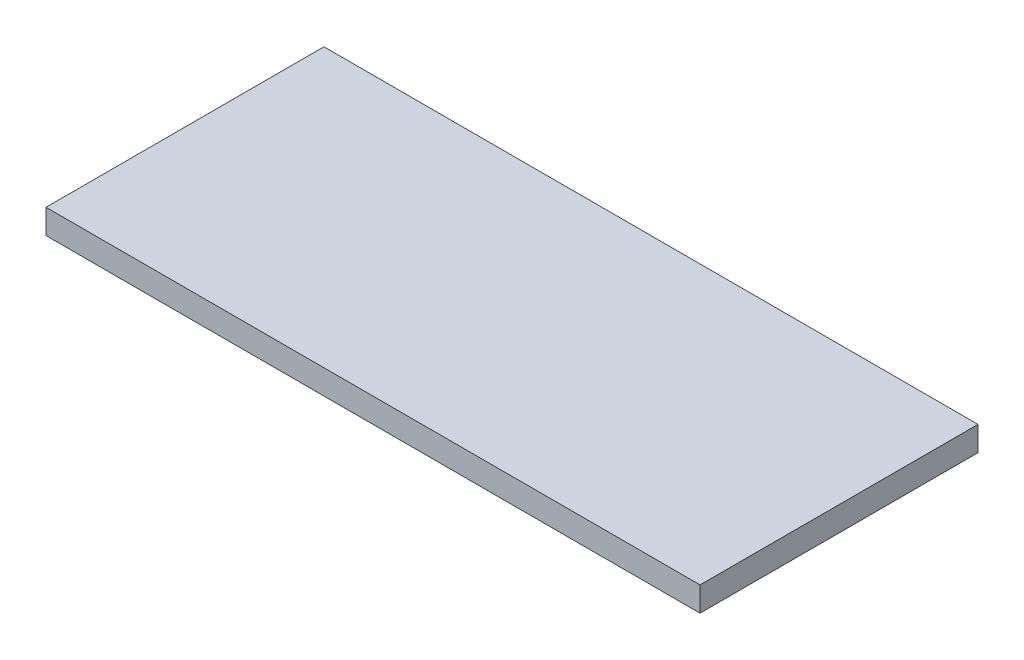
ISO-10303-21;
HEADER;
FILE_DESCRIPTION(('STEP AP214'),'2;1');
FILE_NAME('part.step','',(''),(''),'','','');
FILE_SCHEMA(('AUTOMOTIVE_DESIGN { 1 0 10303 214 1 1 1 1 }'));
ENDSEC;
DATA;
#1=APPLICATION_CONTEXT('core data for automotive mechanical design processes');
#2=APPLICATION_PROTOCOL_DEFINITION('international standard','automotive_design',2000,#1);
#3=PRODUCT_CONTEXT('',#1,'mechanical');
#4=PRODUCT('Part','Part','',(#3));
#5=PRODUCT_RELATED_PRODUCT_CATEGORY('part','',(#4));
#6=PRODUCT_DEFINITION_FORMATION('','',#4);
#7=PRODUCT_DEFINITION_CONTEXT('part definition',#1,'design');
#8=PRODUCT_DEFINITION('design','',#6,#7);
#9=PRODUCT_DEFINITION_SHAPE('','',#8);
#10=(LENGTH_UNIT() NAMED_UNIT(*) SI_UNIT(.MILLI.,.METRE.));
#11=(NAMED_UNIT(*) PLANE_ANGLE_UNIT() SI_UNIT($,.RADIAN.));
#12=(NAMED_UNIT(*) SI_UNIT($,.STERADIAN.) SOLID_ANGLE_UNIT());
#13=UNCERTAINTY_MEASURE_WITH_UNIT(LENGTH_MEASURE(1.E-05),#10,'distance_accuracy_value','');
#14=(GEOMETRIC_REPRESENTATION_CONTEXT(3) GLOBAL_UNCERTAINTY_ASSIGNED_CONTEXT((#13)) GLOBAL_UNIT_ASSIGNED_CONTEXT((#10,
#11,#12)) REPRESENTATION_CONTEXT('',''));
#15=CARTESIAN_POINT('',(0.,0.,0.));
#16=DIRECTION('',(0.,0.,1.));
#17=DIRECTION('',(1.,0.,0.));
#18=AXIS2_PLACEMENT_3D('',#15,#16,#17);
#19=CARTESIAN_POINT('',(-127.,9.525,53.975));
#20=DIRECTION('',(0.,0.,-1.));
#21=DIRECTION('',(-1.,0.,0.));
#22=AXIS2_PLACEMENT_3D('',#19,#20,#21);
#23=PLANE('',#22);
#24=DIRECTION('',(1.,0.,0.));
#25=VECTOR('',#24,1.);
#26=CARTESIAN_POINT('',(-127.,0.,53.975));
#27=LINE('',#26,#25);
#28=CARTESIAN_POINT('',(-127.,0.,53.975));
#29=VERTEX_POINT('',#28);
#30=CARTESIAN_POINT('',(127.,0.,53.975));
#31=VERTEX_POINT('',#30);
#32=EDGE_CURVE('E107',#29,#31,#27,.T.);
#33=ORIENTED_EDGE('',*,*,#32,.T.);
#34=DIRECTION('',(0.,-1.,0.));
#35=VECTOR('',#34,1.);
#36=CARTESIAN_POINT('',(127.,9.525,53.975));
#37=LINE('',#36,#35);
#38=CARTESIAN_POINT('',(127.,9.525,53.975));
#39=VERTEX_POINT('',#38);
#40=EDGE_CURVE('E11',#39,#31,#37,.T.);
#41=ORIENTED_EDGE('',*,*,#40,.F.);
#42=DIRECTION('',(1.,0.,0.));
#43=VECTOR('',#42,1.);
#44=CARTESIAN_POINT('',(-127.,9.525,53.975));
#45=LINE('',#44,#43);
#46=CARTESIAN_POINT('',(-127.,9.525,53.975));
#47=VERTEX_POINT('',#46);
#48=EDGE_CURVE('E89',#47,#39,#45,.T.);
#49=ORIENTED_EDGE('',*,*,#48,.F.);
#50=DIRECTION('',(0.,-1.,0.));
#51=VECTOR('',#50,1.);
#52=CARTESIAN_POINT('',(-127.,9.525,53.975));
#53=LINE('',#52,#51);
#54=EDGE_CURVE('E56',#47,#29,#53,.T.);
#55=ORIENTED_EDGE('',*,*,#54,.T.);
#56=EDGE_LOOP('',(#33,#41,#49,#55));
#57=FACE_BOUND('',#56,.T.);
#58=ADVANCED_FACE('F39',(#57),#23,.F.);
#59=CARTESIAN_POINT('',(127.,9.525,53.975));
#60=DIRECTION('',(-1.,0.,0.));
#61=DIRECTION('',(0.,0.,1.));
#62=AXIS2_PLACEMENT_3D('',#59,#60,#61);
#63=PLANE('',#62);
#64=DIRECTION('',(0.,0.,-1.));
#65=VECTOR('',#64,1.);
#66=CARTESIAN_POINT('',(127.,0.,53.975));
#67=LINE('',#66,#65);
#68=CARTESIAN_POINT('',(127.,0.,-53.975));
#69=VERTEX_POINT('',#68);
#70=EDGE_CURVE('E95',#31,#69,#67,.T.);
#71=ORIENTED_EDGE('',*,*,#70,.T.);
#72=DIRECTION('',(0.,-1.,0.));
#73=VECTOR('',#72,1.);
#74=CARTESIAN_POINT('',(127.,9.525,-53.975));
#75=LINE('',#74,#73);
#76=CARTESIAN_POINT('',(127.,9.525,-53.975));
#77=VERTEX_POINT('',#76);
#78=EDGE_CURVE('E48',#77,#69,#75,.T.);
#79=ORIENTED_EDGE('',*,*,#78,.F.);
#80=DIRECTION('',(0.,0.,-1.));
#81=VECTOR('',#80,1.);
#82=CARTESIAN_POINT('',(127.,9.525,53.975));
#83=LINE('',#82,#81);
#84=EDGE_CURVE('E81',#39,#77,#83,.T.);
#85=ORIENTED_EDGE('',*,*,#84,.F.);
#86=ORIENTED_EDGE('',*,*,#40,.T.);
#87=EDGE_LOOP('',(#71,#79,#85,#86));
#88=FACE_BOUND('',#87,.T.);
#89=ADVANCED_FACE('F94',(#88),#63,.F.);
#90=CARTESIAN_POINT('',(-127.,9.525,-53.975));
#91=DIRECTION('',(0.,0.,-1.));
#92=DIRECTION('',(-1.,0.,0.));
#93=AXIS2_PLACEMENT_3D('',#90,#91,#92);
#94=PLANE('',#93);
#95=DIRECTION('',(1.,0.,0.));
#96=VECTOR('',#95,1.);
#97=CARTESIAN_POINT('',(-127.,0.,-53.975));
#98=LINE('',#97,#96);
#99=CARTESIAN_POINT('',(-127.,0.,-53.975));
#100=VERTEX_POINT('',#99);
#101=EDGE_CURVE('E112',#100,#69,#98,.T.);
#102=ORIENTED_EDGE('',*,*,#101,.F.);
#103=DIRECTION('',(0.,-1.,0.));
#104=VECTOR('',#103,1.);
#105=CARTESIAN_POINT('',(-127.,9.525,-53.975));
#106=LINE('',#105,#104);
#107=CARTESIAN_POINT('',(-127.,9.525,-53.975));
#108=VERTEX_POINT('',#107);
#109=EDGE_CURVE('E70',#108,#100,#106,.T.);
#110=ORIENTED_EDGE('',*,*,#109,.F.);
#111=DIRECTION('',(1.,0.,0.));
#112=VECTOR('',#111,1.);
#113=CARTESIAN_POINT('',(-127.,9.525,-53.975));
#114=LINE('',#113,#112);
#115=EDGE_CURVE('E88',#108,#77,#114,.T.);
#116=ORIENTED_EDGE('',*,*,#115,.T.);
#117=ORIENTED_EDGE('',*,*,#78,.T.);
#118=EDGE_LOOP('',(#102,#110,#116,#117));
#119=FACE_BOUND('',#118,.T.);
#120=ADVANCED_FACE('F99',(#119),#94,.T.);
#121=CARTESIAN_POINT('',(-127.,9.525,53.975));
#122=DIRECTION('',(-1.,0.,0.));
#123=DIRECTION('',(0.,0.,1.));
#124=AXIS2_PLACEMENT_3D('',#121,#122,#123);
#125=PLANE('',#124);
#126=DIRECTION('',(0.,0.,-1.));
#127=VECTOR('',#126,1.);
#128=CARTESIAN_POINT('',(-127.,0.,53.975));
#129=LINE('',#128,#127);
#130=EDGE_CURVE('E115',#29,#100,#129,.T.);
#131=ORIENTED_EDGE('',*,*,#130,.F.);
#132=ORIENTED_EDGE('',*,*,#54,.F.);
#133=DIRECTION('',(0.,0.,-1.));
#134=VECTOR('',#133,1.);
#135=CARTESIAN_POINT('',(-127.,9.525,53.975));
#136=LINE('',#135,#134);
#137=EDGE_CURVE('E101',#47,#108,#136,.T.);
#138=ORIENTED_EDGE('',*,*,#137,.T.);
#139=ORIENTED_EDGE('',*,*,#109,.T.);
#140=EDGE_LOOP('',(#131,#132,#138,#139));
#141=FACE_BOUND('',#140,.T.);
#142=ADVANCED_FACE('F125',(#141),#125,.T.);
#143=CARTESIAN_POINT('',(0.,9.525,0.));
#144=DIRECTION('',(0.,1.,0.));
#145=DIRECTION('',(0.,0.,1.));
#146=AXIS2_PLACEMENT_3D('',#143,#144,#145);
#147=PLANE('',#146);
#148=ORIENTED_EDGE('',*,*,#48,.T.);
#149=ORIENTED_EDGE('',*,*,#84,.T.);
#150=ORIENTED_EDGE('',*,*,#115,.F.);
#151=ORIENTED_EDGE('',*,*,#137,.F.);
#152=EDGE_LOOP('',(#148,#149,#150,#151));
#153=FACE_BOUND('',#152,.T.);
#154=ADVANCED_FACE('F85',(#153),#147,.T.);
#155=CARTESIAN_POINT('',(0.,0.,0.));
#156=DIRECTION('',(0.,1.,0.));
#157=DIRECTION('',(0.,0.,1.));
#158=AXIS2_PLACEMENT_3D('',#155,#156,#157);
#159=PLANE('',#158);
#160=ORIENTED_EDGE('',*,*,#32,.F.);
#161=ORIENTED_EDGE('',*,*,#130,.T.);
#162=ORIENTED_EDGE('',*,*,#101,.T.);
#163=ORIENTED_EDGE('',*,*,#70,.F.);
#164=EDGE_LOOP('',(#160,#161,#162,#163));
#165=FACE_BOUND('',#164,.T.);
#166=ADVANCED_FACE('F124',(#165),#159,.F.);
#167=CLOSED_SHELL('',(#58,#89,#120,#142,#154,#166));
#168=MANIFOLD_SOLID_BREP('B2',#167);
#169=ADVANCED_BREP_SHAPE_REPRESENTATION('',(#18,#168),#14);
#170=SHAPE_DEFINITION_REPRESENTATION(#9,#169);
ENDSEC;
END-ISO-10303-21;
